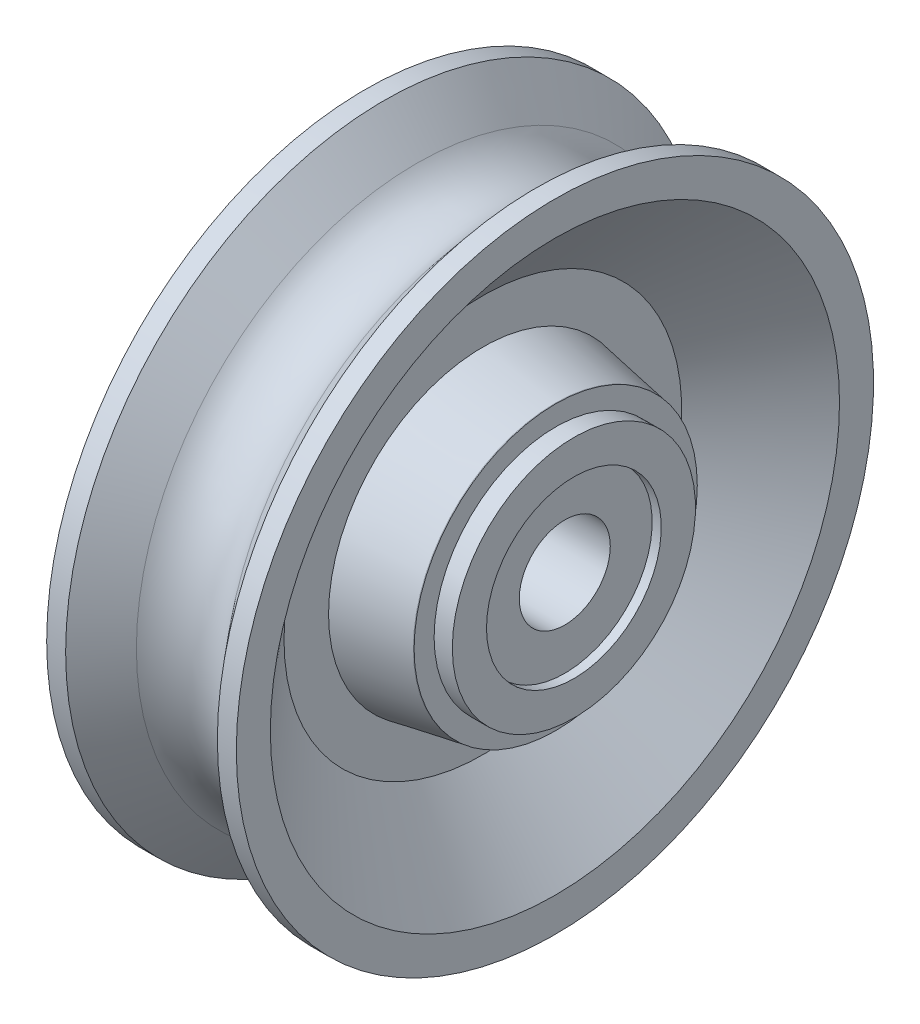
ISO-10303-21;
HEADER;
FILE_DESCRIPTION(('STEP AP214'),'2;1');
FILE_NAME('part.step','',(''),(''),'','','');
FILE_SCHEMA(('AUTOMOTIVE_DESIGN { 1 0 10303 214 1 1 1 1 }'));
ENDSEC;
DATA;
#1=APPLICATION_CONTEXT('core data for automotive mechanical design processes');
#2=APPLICATION_PROTOCOL_DEFINITION('international standard','automotive_design',2000,#1);
#3=PRODUCT_CONTEXT('',#1,'mechanical');
#4=PRODUCT('Part','Part','',(#3));
#5=PRODUCT_RELATED_PRODUCT_CATEGORY('part','',(#4));
#6=PRODUCT_DEFINITION_FORMATION('','',#4);
#7=PRODUCT_DEFINITION_CONTEXT('part definition',#1,'design');
#8=PRODUCT_DEFINITION('design','',#6,#7);
#9=PRODUCT_DEFINITION_SHAPE('','',#8);
#10=(LENGTH_UNIT() NAMED_UNIT(*) SI_UNIT(.MILLI.,.METRE.));
#11=(NAMED_UNIT(*) PLANE_ANGLE_UNIT() SI_UNIT($,.RADIAN.));
#12=(NAMED_UNIT(*) SI_UNIT($,.STERADIAN.) SOLID_ANGLE_UNIT());
#13=UNCERTAINTY_MEASURE_WITH_UNIT(LENGTH_MEASURE(1.E-05),#10,'distance_accuracy_value','');
#14=(GEOMETRIC_REPRESENTATION_CONTEXT(3) GLOBAL_UNCERTAINTY_ASSIGNED_CONTEXT((#13)) GLOBAL_UNIT_ASSIGNED_CONTEXT((#10,
#11,#12)) REPRESENTATION_CONTEXT('',''));
#15=CARTESIAN_POINT('',(0.,0.,0.));
#16=DIRECTION('',(0.,0.,1.));
#17=DIRECTION('',(1.,0.,0.));
#18=AXIS2_PLACEMENT_3D('',#15,#16,#17);
#19=CARTESIAN_POINT('',(-7.9375,0.,0.));
#20=DIRECTION('',(-1.,0.,0.));
#21=DIRECTION('',(0.,0.,1.));
#22=AXIS2_PLACEMENT_3D('',#19,#20,#21);
#23=CYLINDRICAL_SURFACE('',#22,3.175);
#24=CARTESIAN_POINT('',(-7.3025,0.,0.));
#25=DIRECTION('',(-1.,0.,0.));
#26=DIRECTION('',(0.,0.,1.));
#27=AXIS2_PLACEMENT_3D('',#24,#25,#26);
#28=CIRCLE('',#27,3.175);
#29=CARTESIAN_POINT('',(-7.3025,0.,3.175));
#30=VERTEX_POINT('',#29);
#31=EDGE_CURVE('E64',#30,#30,#28,.F.);
#32=ORIENTED_EDGE('',*,*,#31,.F.);
#33=EDGE_LOOP('',(#32));
#34=FACE_BOUND('',#33,.T.);
#35=CARTESIAN_POINT('',(7.3025,0.,0.));
#36=DIRECTION('',(1.,0.,0.));
#37=DIRECTION('',(0.,0.,-1.));
#38=AXIS2_PLACEMENT_3D('',#35,#36,#37);
#39=CIRCLE('',#38,3.175);
#40=CARTESIAN_POINT('',(7.3025,0.,-3.175));
#41=VERTEX_POINT('',#40);
#42=EDGE_CURVE('E36',#41,#41,#39,.F.);
#43=ORIENTED_EDGE('',*,*,#42,.F.);
#44=EDGE_LOOP('',(#43));
#45=FACE_BOUND('',#44,.T.);
#46=ADVANCED_FACE('F32',(#34,#45),#23,.F.);
#47=CARTESIAN_POINT('',(7.9375,9.87777777777778,0.));
#48=DIRECTION('',(-1.,0.,0.));
#49=DIRECTION('',(0.,0.,1.));
#50=AXIS2_PLACEMENT_3D('',#47,#48,#49);
#51=PLANE('',#50);
#52=CARTESIAN_POINT('',(7.9375,0.,0.));
#53=DIRECTION('',(-1.,0.,0.));
#54=DIRECTION('',(0.,0.,1.));
#55=AXIS2_PLACEMENT_3D('',#52,#53,#54);
#56=CIRCLE('',#55,8.48077777777778);
#57=CARTESIAN_POINT('',(7.9375,0.,8.48077777777778));
#58=VERTEX_POINT('',#57);
#59=EDGE_CURVE('E77',#58,#58,#56,.T.);
#60=ORIENTED_EDGE('',*,*,#59,.F.);
#61=EDGE_LOOP('',(#60));
#62=FACE_BOUND('',#61,.T.);
#63=CARTESIAN_POINT('',(7.9375,0.,0.));
#64=DIRECTION('',(-1.,0.,0.));
#65=DIRECTION('',(0.,0.,1.));
#66=AXIS2_PLACEMENT_3D('',#63,#64,#65);
#67=CIRCLE('',#66,6.096);
#68=CARTESIAN_POINT('',(7.9375,0.,6.096));
#69=VERTEX_POINT('',#68);
#70=EDGE_CURVE('E84',#69,#69,#67,.T.);
#71=ORIENTED_EDGE('',*,*,#70,.T.);
#72=EDGE_LOOP('',(#71));
#73=FACE_BOUND('',#72,.T.);
#74=ADVANCED_FACE('F134',(#62,#73),#51,.F.);
#75=CARTESIAN_POINT('',(-7.9375,0.,0.));
#76=DIRECTION('',(-1.,0.,0.));
#77=DIRECTION('',(0.,0.,1.));
#78=AXIS2_PLACEMENT_3D('',#75,#76,#77);
#79=CYLINDRICAL_SURFACE('',#78,9.87777777777778);
#80=CARTESIAN_POINT('',(6.61458333333333,0.,0.));
#81=DIRECTION('',(-1.,0.,0.));
#82=DIRECTION('',(0.,0.,1.));
#83=AXIS2_PLACEMENT_3D('',#80,#81,#82);
#84=CIRCLE('',#83,9.87777777777778);
#85=CARTESIAN_POINT('',(6.61458333333333,0.,9.87777777777778));
#86=VERTEX_POINT('',#85);
#87=EDGE_CURVE('E58',#86,#86,#84,.T.);
#88=ORIENTED_EDGE('',*,*,#87,.F.);
#89=EDGE_LOOP('',(#88));
#90=FACE_BOUND('',#89,.T.);
#91=CARTESIAN_POINT('',(6.6675,0.,0.));
#92=DIRECTION('',(1.,0.,0.));
#93=DIRECTION('',(0.,0.,-1.));
#94=AXIS2_PLACEMENT_3D('',#91,#92,#93);
#95=CIRCLE('',#94,9.87777777777778);
#96=CARTESIAN_POINT('',(6.6675,0.,-9.87777777777778));
#97=VERTEX_POINT('',#96);
#98=EDGE_CURVE('E68',#97,#97,#95,.T.);
#99=ORIENTED_EDGE('',*,*,#98,.F.);
#100=EDGE_LOOP('',(#99));
#101=FACE_BOUND('',#100,.T.);
#102=ADVANCED_FACE('F140',(#90,#101),#79,.T.);
#103=CARTESIAN_POINT('',(-7.9375,0.,0.));
#104=DIRECTION('',(-1.,0.,0.));
#105=DIRECTION('',(0.,0.,1.));
#106=AXIS2_PLACEMENT_3D('',#103,#104,#105);
#107=CYLINDRICAL_SURFACE('',#106,9.87777777777778);
#108=CARTESIAN_POINT('',(-6.61458333333333,0.,0.));
#109=DIRECTION('',(-1.,0.,0.));
#110=DIRECTION('',(0.,0.,1.));
#111=AXIS2_PLACEMENT_3D('',#108,#109,#110);
#112=CIRCLE('',#111,9.87777777777778);
#113=CARTESIAN_POINT('',(-6.61458333333333,0.,9.87777777777778));
#114=VERTEX_POINT('',#113);
#115=EDGE_CURVE('E57',#114,#114,#112,.T.);
#116=ORIENTED_EDGE('',*,*,#115,.T.);
#117=EDGE_LOOP('',(#116));
#118=FACE_BOUND('',#117,.T.);
#119=CARTESIAN_POINT('',(-6.6675,0.,0.));
#120=DIRECTION('',(-1.,0.,0.));
#121=DIRECTION('',(0.,0.,1.));
#122=AXIS2_PLACEMENT_3D('',#119,#120,#121);
#123=CIRCLE('',#122,9.87777777777778);
#124=CARTESIAN_POINT('',(-6.6675,0.,9.87777777777778));
#125=VERTEX_POINT('',#124);
#126=EDGE_CURVE('E59',#125,#125,#123,.T.);
#127=ORIENTED_EDGE('',*,*,#126,.F.);
#128=EDGE_LOOP('',(#127));
#129=FACE_BOUND('',#128,.T.);
#130=ADVANCED_FACE('F151',(#118,#129),#107,.T.);
#131=CARTESIAN_POINT('',(-7.9375,3.175,0.));
#132=DIRECTION('',(1.,0.,0.));
#133=DIRECTION('',(0.,0.,-1.));
#134=AXIS2_PLACEMENT_3D('',#131,#132,#133);
#135=PLANE('',#134);
#136=CARTESIAN_POINT('',(-7.9375,0.,0.));
#137=DIRECTION('',(-1.,0.,0.));
#138=DIRECTION('',(0.,0.,1.));
#139=AXIS2_PLACEMENT_3D('',#136,#137,#138);
#140=CIRCLE('',#139,6.096);
#141=CARTESIAN_POINT('',(-7.9375,0.,6.096));
#142=VERTEX_POINT('',#141);
#143=EDGE_CURVE('E70',#142,#142,#140,.T.);
#144=ORIENTED_EDGE('',*,*,#143,.F.);
#145=EDGE_LOOP('',(#144));
#146=FACE_BOUND('',#145,.T.);
#147=CARTESIAN_POINT('',(-7.9375,0.,0.));
#148=DIRECTION('',(-1.,0.,0.));
#149=DIRECTION('',(0.,0.,1.));
#150=AXIS2_PLACEMENT_3D('',#147,#148,#149);
#151=CIRCLE('',#150,8.48077777777778);
#152=CARTESIAN_POINT('',(-7.9375,0.,8.48077777777778));
#153=VERTEX_POINT('',#152);
#154=EDGE_CURVE('E66',#153,#153,#151,.T.);
#155=ORIENTED_EDGE('',*,*,#154,.T.);
#156=EDGE_LOOP('',(#155));
#157=FACE_BOUND('',#156,.T.);
#158=ADVANCED_FACE('F147',(#146,#157),#135,.F.);
#159=CARTESIAN_POINT('',(6.61458333333333,22.225,0.));
#160=DIRECTION('',(-1.,0.,0.));
#161=DIRECTION('',(0.,0.,1.));
#162=AXIS2_PLACEMENT_3D('',#159,#160,#161);
#163=PLANE('',#162);
#164=CARTESIAN_POINT('',(6.61458333333333,0.,0.));
#165=DIRECTION('',(-1.,0.,0.));
#166=DIRECTION('',(0.,0.,1.));
#167=AXIS2_PLACEMENT_3D('',#164,#165,#166);
#168=CIRCLE('',#167,22.225);
#169=CARTESIAN_POINT('',(6.61458333333333,0.,22.225));
#170=VERTEX_POINT('',#169);
#171=EDGE_CURVE('E112',#170,#170,#168,.T.);
#172=ORIENTED_EDGE('',*,*,#171,.F.);
#173=EDGE_LOOP('',(#172));
#174=FACE_BOUND('',#173,.T.);
#175=CARTESIAN_POINT('',(6.61458333333333,0.,0.));
#176=DIRECTION('',(-1.,0.,0.));
#177=DIRECTION('',(0.,0.,1.));
#178=AXIS2_PLACEMENT_3D('',#175,#176,#177);
#179=CIRCLE('',#178,19.8514560982745);
#180=CARTESIAN_POINT('',(6.61458333333333,0.,19.8514560982745));
#181=VERTEX_POINT('',#180);
#182=EDGE_CURVE('E54',#181,#181,#179,.F.);
#183=ORIENTED_EDGE('',*,*,#182,.F.);
#184=EDGE_LOOP('',(#183));
#185=FACE_BOUND('',#184,.T.);
#186=ADVANCED_FACE('F150',(#174,#185),#163,.F.);
#187=CARTESIAN_POINT('',(-6.61458333333333,9.87777777777778,0.));
#188=DIRECTION('',(1.,0.,0.));
#189=DIRECTION('',(0.,0.,-1.));
#190=AXIS2_PLACEMENT_3D('',#187,#188,#189);
#191=PLANE('',#190);
#192=CARTESIAN_POINT('',(-6.61458333333333,0.,0.));
#193=DIRECTION('',(-1.,0.,0.));
#194=DIRECTION('',(0.,0.,1.));
#195=AXIS2_PLACEMENT_3D('',#192,#193,#194);
#196=CIRCLE('',#195,22.225);
#197=CARTESIAN_POINT('',(-6.61458333333333,0.,22.225));
#198=VERTEX_POINT('',#197);
#199=EDGE_CURVE('E45',#198,#198,#196,.T.);
#200=ORIENTED_EDGE('',*,*,#199,.T.);
#201=EDGE_LOOP('',(#200));
#202=FACE_BOUND('',#201,.T.);
#203=CARTESIAN_POINT('',(-6.61458333333333,0.,0.));
#204=DIRECTION('',(1.,0.,0.));
#205=DIRECTION('',(0.,0.,-1.));
#206=AXIS2_PLACEMENT_3D('',#203,#204,#205);
#207=CIRCLE('',#206,19.8514560982745);
#208=CARTESIAN_POINT('',(-6.61458333333333,0.,-19.8514560982745));
#209=VERTEX_POINT('',#208);
#210=EDGE_CURVE('E49',#209,#209,#207,.F.);
#211=ORIENTED_EDGE('',*,*,#210,.F.);
#212=EDGE_LOOP('',(#211));
#213=FACE_BOUND('',#212,.T.);
#214=ADVANCED_FACE('F117',(#202,#213),#191,.F.);
#215=CARTESIAN_POINT('',(0.,0.,0.));
#216=DIRECTION('',(-1.,0.,0.));
#217=DIRECTION('',(0.,0.,1.));
#218=AXIS2_PLACEMENT_3D('',#215,#216,#217);
#219=TOROIDAL_SURFACE('',#218,22.098,3.96875000000001);
#220=CARTESIAN_POINT('',(-3.03785610762078,0.,0.));
#221=DIRECTION('',(-1.,0.,0.));
#222=DIRECTION('',(0.,0.,1.));
#223=AXIS2_PLACEMENT_3D('',#220,#221,#222);
#224=CIRCLE('',#223,19.5440996824678);
#225=CARTESIAN_POINT('',(-3.03785610762078,0.,19.5440996824678));
#226=VERTEX_POINT('',#225);
#227=EDGE_CURVE('E10',#226,#226,#224,.T.);
#228=ORIENTED_EDGE('',*,*,#227,.F.);
#229=EDGE_LOOP('',(#228));
#230=FACE_BOUND('',#229,.T.);
#231=CARTESIAN_POINT('',(3.03785610762078,0.,0.));
#232=DIRECTION('',(-1.,0.,0.));
#233=DIRECTION('',(0.,0.,1.));
#234=AXIS2_PLACEMENT_3D('',#231,#232,#233);
#235=CIRCLE('',#234,19.5440996824678);
#236=CARTESIAN_POINT('',(3.03785610762078,0.,19.5440996824678));
#237=VERTEX_POINT('',#236);
#238=EDGE_CURVE('E52',#237,#237,#235,.T.);
#239=ORIENTED_EDGE('',*,*,#238,.T.);
#240=EDGE_LOOP('',(#239));
#241=FACE_BOUND('',#240,.T.);
#242=ADVANCED_FACE('F34',(#230,#241),#219,.F.);
#243=CARTESIAN_POINT('',(-3.03785610762078,0.,0.));
#244=DIRECTION('',(-1.,0.,0.));
#245=DIRECTION('',(0.,0.,1.));
#246=AXIS2_PLACEMENT_3D('',#243,#244,#245);
#247=CONICAL_SURFACE('',#246,19.5440996824678,0.871731112655626);
#248=CARTESIAN_POINT('',(-5.29166666666667,0.,0.));
#249=DIRECTION('',(-1.,0.,0.));
#250=DIRECTION('',(0.,0.,1.));
#251=AXIS2_PLACEMENT_3D('',#248,#249,#250);
#252=CIRCLE('',#251,22.225);
#253=CARTESIAN_POINT('',(-5.29166666666667,0.,22.225));
#254=VERTEX_POINT('',#253);
#255=EDGE_CURVE('E40',#254,#254,#252,.T.);
#256=ORIENTED_EDGE('',*,*,#255,.F.);
#257=EDGE_LOOP('',(#256));
#258=FACE_BOUND('',#257,.T.);
#259=ORIENTED_EDGE('',*,*,#227,.T.);
#260=EDGE_LOOP('',(#259));
#261=FACE_BOUND('',#260,.T.);
#262=ADVANCED_FACE('F124',(#258,#261),#247,.T.);
#263=CARTESIAN_POINT('',(-7.9375,0.,0.));
#264=DIRECTION('',(-1.,0.,0.));
#265=DIRECTION('',(0.,0.,1.));
#266=AXIS2_PLACEMENT_3D('',#263,#264,#265);
#267=CYLINDRICAL_SURFACE('',#266,22.225);
#268=ORIENTED_EDGE('',*,*,#199,.F.);
#269=EDGE_LOOP('',(#268));
#270=FACE_BOUND('',#269,.T.);
#271=ORIENTED_EDGE('',*,*,#255,.T.);
#272=EDGE_LOOP('',(#271));
#273=FACE_BOUND('',#272,.T.);
#274=ADVANCED_FACE('F120',(#270,#273),#267,.T.);
#275=CARTESIAN_POINT('',(-7.9375,0.,0.));
#276=DIRECTION('',(-1.,0.,0.));
#277=DIRECTION('',(0.,0.,1.));
#278=AXIS2_PLACEMENT_3D('',#275,#276,#277);
#279=CYLINDRICAL_SURFACE('',#278,22.225);
#280=CARTESIAN_POINT('',(5.29166666666667,0.,0.));
#281=DIRECTION('',(-1.,0.,0.));
#282=DIRECTION('',(0.,0.,1.));
#283=AXIS2_PLACEMENT_3D('',#280,#281,#282);
#284=CIRCLE('',#283,22.225);
#285=CARTESIAN_POINT('',(5.29166666666667,0.,22.225));
#286=VERTEX_POINT('',#285);
#287=EDGE_CURVE('E109',#286,#286,#284,.T.);
#288=ORIENTED_EDGE('',*,*,#287,.F.);
#289=EDGE_LOOP('',(#288));
#290=FACE_BOUND('',#289,.T.);
#291=ORIENTED_EDGE('',*,*,#171,.T.);
#292=EDGE_LOOP('',(#291));
#293=FACE_BOUND('',#292,.T.);
#294=ADVANCED_FACE('F123',(#290,#293),#279,.T.);
#295=CARTESIAN_POINT('',(5.29166666666667,0.,0.));
#296=DIRECTION('',(1.,0.,0.));
#297=DIRECTION('',(0.,0.,-1.));
#298=AXIS2_PLACEMENT_3D('',#295,#296,#297);
#299=CONICAL_SURFACE('',#298,22.225,0.871731112655626);
#300=ORIENTED_EDGE('',*,*,#238,.F.);
#301=EDGE_LOOP('',(#300));
#302=FACE_BOUND('',#301,.T.);
#303=ORIENTED_EDGE('',*,*,#287,.T.);
#304=EDGE_LOOP('',(#303));
#305=FACE_BOUND('',#304,.T.);
#306=ADVANCED_FACE('F208',(#302,#305),#299,.T.);
#307=CARTESIAN_POINT('',(-1.5875,0.,0.));
#308=DIRECTION('',(-1.,0.,0.));
#309=DIRECTION('',(0.,0.,1.));
#310=AXIS2_PLACEMENT_3D('',#307,#308,#309);
#311=CONICAL_SURFACE('',#310,13.8717568504817,0.871731112655626);
#312=CARTESIAN_POINT('',(-1.5875,0.,0.));
#313=DIRECTION('',(-1.,0.,0.));
#314=DIRECTION('',(0.,0.,1.));
#315=AXIS2_PLACEMENT_3D('',#312,#313,#314);
#316=CIRCLE('',#315,13.8717568504817);
#317=CARTESIAN_POINT('',(-1.5875,0.,13.8717568504817));
#318=VERTEX_POINT('',#317);
#319=EDGE_CURVE('E53',#318,#318,#316,.T.);
#320=ORIENTED_EDGE('',*,*,#319,.F.);
#321=EDGE_LOOP('',(#320));
#322=FACE_BOUND('',#321,.T.);
#323=ORIENTED_EDGE('',*,*,#210,.T.);
#324=EDGE_LOOP('',(#323));
#325=FACE_BOUND('',#324,.T.);
#326=ADVANCED_FACE('F205',(#322,#325),#311,.F.);
#327=CARTESIAN_POINT('',(-1.5875,10.7641882037143,0.));
#328=DIRECTION('',(-1.,0.,0.));
#329=DIRECTION('',(0.,0.,1.));
#330=AXIS2_PLACEMENT_3D('',#327,#328,#329);
#331=PLANE('',#330);
#332=ORIENTED_EDGE('',*,*,#319,.T.);
#333=EDGE_LOOP('',(#332));
#334=FACE_BOUND('',#333,.T.);
#335=CARTESIAN_POINT('',(-1.5875,0.,0.));
#336=DIRECTION('',(-1.,0.,0.));
#337=DIRECTION('',(0.,0.,1.));
#338=AXIS2_PLACEMENT_3D('',#335,#336,#337);
#339=CIRCLE('',#338,10.7641882037143);
#340=CARTESIAN_POINT('',(-1.5875,0.,10.7641882037143));
#341=VERTEX_POINT('',#340);
#342=EDGE_CURVE('E102',#341,#341,#339,.T.);
#343=ORIENTED_EDGE('',*,*,#342,.F.);
#344=EDGE_LOOP('',(#343));
#345=FACE_BOUND('',#344,.T.);
#346=ADVANCED_FACE('F197',(#334,#345),#331,.T.);
#347=CARTESIAN_POINT('',(-6.61458333333333,0.,0.));
#348=DIRECTION('',(1.,0.,0.));
#349=DIRECTION('',(0.,0.,-1.));
#350=AXIS2_PLACEMENT_3D('',#347,#348,#349);
#351=CONICAL_SURFACE('',#350,9.87777777777778,0.174532925199434);
#352=ORIENTED_EDGE('',*,*,#342,.T.);
#353=EDGE_LOOP('',(#352));
#354=FACE_BOUND('',#353,.T.);
#355=ORIENTED_EDGE('',*,*,#115,.F.);
#356=EDGE_LOOP('',(#355));
#357=FACE_BOUND('',#356,.T.);
#358=ADVANCED_FACE('F191',(#354,#357),#351,.T.);
#359=CARTESIAN_POINT('',(7.9375,0.,0.));
#360=DIRECTION('',(1.,0.,0.));
#361=DIRECTION('',(0.,0.,-1.));
#362=AXIS2_PLACEMENT_3D('',#359,#360,#361);
#363=CONICAL_SURFACE('',#362,21.4250611634832,0.871731112655626);
#364=CARTESIAN_POINT('',(1.5875,0.,0.));
#365=DIRECTION('',(-1.,0.,0.));
#366=DIRECTION('',(0.,0.,1.));
#367=AXIS2_PLACEMENT_3D('',#364,#365,#366);
#368=CIRCLE('',#367,13.8717568504817);
#369=CARTESIAN_POINT('',(1.5875,0.,13.8717568504817));
#370=VERTEX_POINT('',#369);
#371=EDGE_CURVE('E62',#370,#370,#368,.T.);
#372=ORIENTED_EDGE('',*,*,#371,.T.);
#373=EDGE_LOOP('',(#372));
#374=FACE_BOUND('',#373,.T.);
#375=ORIENTED_EDGE('',*,*,#182,.T.);
#376=EDGE_LOOP('',(#375));
#377=FACE_BOUND('',#376,.T.);
#378=ADVANCED_FACE('F179',(#374,#377),#363,.F.);
#379=CARTESIAN_POINT('',(1.5875,0.,0.));
#380=DIRECTION('',(-1.,0.,0.));
#381=DIRECTION('',(0.,0.,1.));
#382=AXIS2_PLACEMENT_3D('',#379,#380,#381);
#383=CONICAL_SURFACE('',#382,10.7641882037143,0.174532925199434);
#384=ORIENTED_EDGE('',*,*,#87,.T.);
#385=EDGE_LOOP('',(#384));
#386=FACE_BOUND('',#385,.T.);
#387=CARTESIAN_POINT('',(1.5875,0.,0.));
#388=DIRECTION('',(-1.,0.,0.));
#389=DIRECTION('',(0.,0.,1.));
#390=AXIS2_PLACEMENT_3D('',#387,#388,#389);
#391=CIRCLE('',#390,10.7641882037143);
#392=CARTESIAN_POINT('',(1.5875,0.,10.7641882037143));
#393=VERTEX_POINT('',#392);
#394=EDGE_CURVE('E95',#393,#393,#391,.T.);
#395=ORIENTED_EDGE('',*,*,#394,.F.);
#396=EDGE_LOOP('',(#395));
#397=FACE_BOUND('',#396,.T.);
#398=ADVANCED_FACE('F175',(#386,#397),#383,.T.);
#399=CARTESIAN_POINT('',(1.5875,10.7641882037143,0.));
#400=DIRECTION('',(1.,0.,0.));
#401=DIRECTION('',(0.,0.,-1.));
#402=AXIS2_PLACEMENT_3D('',#399,#400,#401);
#403=PLANE('',#402);
#404=ORIENTED_EDGE('',*,*,#394,.T.);
#405=EDGE_LOOP('',(#404));
#406=FACE_BOUND('',#405,.T.);
#407=ORIENTED_EDGE('',*,*,#371,.F.);
#408=EDGE_LOOP('',(#407));
#409=FACE_BOUND('',#408,.T.);
#410=ADVANCED_FACE('F178',(#406,#409),#403,.T.);
#411=CARTESIAN_POINT('',(-6.6675,0.,0.));
#412=DIRECTION('',(-1.,0.,0.));
#413=DIRECTION('',(0.,0.,1.));
#414=AXIS2_PLACEMENT_3D('',#411,#412,#413);
#415=PLANE('',#414);
#416=CARTESIAN_POINT('',(-6.6675,0.,0.));
#417=DIRECTION('',(-1.,0.,0.));
#418=DIRECTION('',(0.,0.,1.));
#419=AXIS2_PLACEMENT_3D('',#416,#417,#418);
#420=CIRCLE('',#419,8.48077777777778);
#421=CARTESIAN_POINT('',(-6.6675,0.,8.48077777777778));
#422=VERTEX_POINT('',#421);
#423=EDGE_CURVE('E63',#422,#422,#420,.T.);
#424=ORIENTED_EDGE('',*,*,#423,.F.);
#425=EDGE_LOOP('',(#424));
#426=FACE_BOUND('',#425,.T.);
#427=ORIENTED_EDGE('',*,*,#126,.T.);
#428=EDGE_LOOP('',(#427));
#429=FACE_BOUND('',#428,.T.);
#430=ADVANCED_FACE('F185',(#426,#429),#415,.T.);
#431=CARTESIAN_POINT('',(-6.6675,0.,0.));
#432=DIRECTION('',(-1.,0.,0.));
#433=DIRECTION('',(0.,0.,1.));
#434=AXIS2_PLACEMENT_3D('',#431,#432,#433);
#435=CYLINDRICAL_SURFACE('',#434,8.48077777777778);
#436=ORIENTED_EDGE('',*,*,#423,.T.);
#437=EDGE_LOOP('',(#436));
#438=FACE_BOUND('',#437,.T.);
#439=ORIENTED_EDGE('',*,*,#154,.F.);
#440=EDGE_LOOP('',(#439));
#441=FACE_BOUND('',#440,.T.);
#442=ADVANCED_FACE('F302',(#438,#441),#435,.T.);
#443=CARTESIAN_POINT('',(-7.3025,0.,0.));
#444=DIRECTION('',(-1.,0.,0.));
#445=DIRECTION('',(0.,0.,1.));
#446=AXIS2_PLACEMENT_3D('',#443,#444,#445);
#447=PLANE('',#446);
#448=CARTESIAN_POINT('',(-7.3025,0.,0.));
#449=DIRECTION('',(-1.,0.,0.));
#450=DIRECTION('',(0.,0.,1.));
#451=AXIS2_PLACEMENT_3D('',#448,#449,#450);
#452=CIRCLE('',#451,6.096);
#453=CARTESIAN_POINT('',(-7.3025,0.,6.096));
#454=VERTEX_POINT('',#453);
#455=EDGE_CURVE('E67',#454,#454,#452,.T.);
#456=ORIENTED_EDGE('',*,*,#455,.T.);
#457=EDGE_LOOP('',(#456));
#458=FACE_BOUND('',#457,.T.);
#459=ORIENTED_EDGE('',*,*,#31,.T.);
#460=EDGE_LOOP('',(#459));
#461=FACE_BOUND('',#460,.T.);
#462=ADVANCED_FACE('F309',(#458,#461),#447,.T.);
#463=CARTESIAN_POINT('',(-7.3025,0.,0.));
#464=DIRECTION('',(-1.,0.,0.));
#465=DIRECTION('',(0.,0.,1.));
#466=AXIS2_PLACEMENT_3D('',#463,#464,#465);
#467=CYLINDRICAL_SURFACE('',#466,6.096);
#468=ORIENTED_EDGE('',*,*,#455,.F.);
#469=EDGE_LOOP('',(#468));
#470=FACE_BOUND('',#469,.T.);
#471=ORIENTED_EDGE('',*,*,#143,.T.);
#472=EDGE_LOOP('',(#471));
#473=FACE_BOUND('',#472,.T.);
#474=ADVANCED_FACE('F316',(#470,#473),#467,.F.);
#475=CARTESIAN_POINT('',(6.6675,0.,0.));
#476=DIRECTION('',(1.,0.,0.));
#477=DIRECTION('',(0.,0.,1.));
#478=AXIS2_PLACEMENT_3D('',#475,#476,#477);
#479=PLANE('',#478);
#480=CARTESIAN_POINT('',(6.6675,0.,0.));
#481=DIRECTION('',(-1.,0.,0.));
#482=DIRECTION('',(0.,0.,1.));
#483=AXIS2_PLACEMENT_3D('',#480,#481,#482);
#484=CIRCLE('',#483,8.48077777777778);
#485=CARTESIAN_POINT('',(6.6675,0.,8.48077777777778));
#486=VERTEX_POINT('',#485);
#487=EDGE_CURVE('E71',#486,#486,#484,.T.);
#488=ORIENTED_EDGE('',*,*,#487,.T.);
#489=EDGE_LOOP('',(#488));
#490=FACE_BOUND('',#489,.T.);
#491=ORIENTED_EDGE('',*,*,#98,.T.);
#492=EDGE_LOOP('',(#491));
#493=FACE_BOUND('',#492,.T.);
#494=ADVANCED_FACE('F325',(#490,#493),#479,.T.);
#495=CARTESIAN_POINT('',(6.6675,0.,0.));
#496=DIRECTION('',(1.,0.,0.));
#497=DIRECTION('',(0.,0.,-1.));
#498=AXIS2_PLACEMENT_3D('',#495,#496,#497);
#499=CYLINDRICAL_SURFACE('',#498,8.48077777777778);
#500=ORIENTED_EDGE('',*,*,#487,.F.);
#501=EDGE_LOOP('',(#500));
#502=FACE_BOUND('',#501,.T.);
#503=ORIENTED_EDGE('',*,*,#59,.T.);
#504=EDGE_LOOP('',(#503));
#505=FACE_BOUND('',#504,.T.);
#506=ADVANCED_FACE('F339',(#502,#505),#499,.T.);
#507=CARTESIAN_POINT('',(7.3025,0.,0.));
#508=DIRECTION('',(1.,0.,0.));
#509=DIRECTION('',(0.,0.,1.));
#510=AXIS2_PLACEMENT_3D('',#507,#508,#509);
#511=PLANE('',#510);
#512=CARTESIAN_POINT('',(7.3025,0.,0.));
#513=DIRECTION('',(-1.,0.,0.));
#514=DIRECTION('',(0.,0.,1.));
#515=AXIS2_PLACEMENT_3D('',#512,#513,#514);
#516=CIRCLE('',#515,6.096);
#517=CARTESIAN_POINT('',(7.3025,0.,6.096));
#518=VERTEX_POINT('',#517);
#519=EDGE_CURVE('E388',#518,#518,#516,.T.);
#520=ORIENTED_EDGE('',*,*,#519,.F.);
#521=EDGE_LOOP('',(#520));
#522=FACE_BOUND('',#521,.T.);
#523=ORIENTED_EDGE('',*,*,#42,.T.);
#524=EDGE_LOOP('',(#523));
#525=FACE_BOUND('',#524,.T.);
#526=ADVANCED_FACE('F347',(#522,#525),#511,.T.);
#527=CARTESIAN_POINT('',(7.3025,0.,0.));
#528=DIRECTION('',(1.,0.,0.));
#529=DIRECTION('',(0.,0.,-1.));
#530=AXIS2_PLACEMENT_3D('',#527,#528,#529);
#531=CYLINDRICAL_SURFACE('',#530,6.096);
#532=ORIENTED_EDGE('',*,*,#519,.T.);
#533=EDGE_LOOP('',(#532));
#534=FACE_BOUND('',#533,.T.);
#535=ORIENTED_EDGE('',*,*,#70,.F.);
#536=EDGE_LOOP('',(#535));
#537=FACE_BOUND('',#536,.T.);
#538=ADVANCED_FACE('F364',(#534,#537),#531,.F.);
#539=CLOSED_SHELL('',(#46,#74,#102,#130,#158,#186,#214,#242,#262,#274,#294,#306,#326,#346,#358,
#378,#398,#410,#430,#442,#462,#474,#494,#506,#526,#538));
#540=MANIFOLD_SOLID_BREP('B2',#539);
#541=ADVANCED_BREP_SHAPE_REPRESENTATION('',(#18,#540),#14);
#542=SHAPE_DEFINITION_REPRESENTATION(#9,#541);
ENDSEC;
END-ISO-10303-21;
